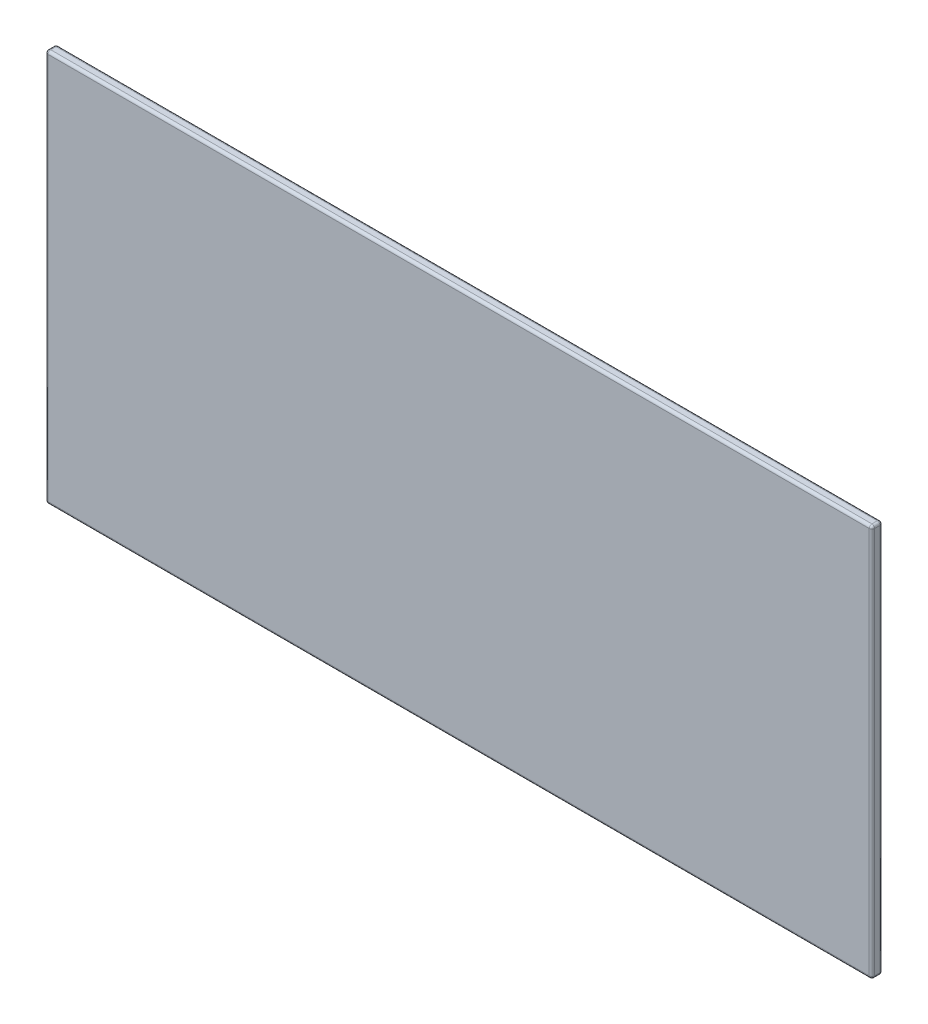
ISO-10303-21;
HEADER;
FILE_DESCRIPTION(('STEP AP214'),'2;1');
FILE_NAME('part.step','',(''),(''),'','','');
FILE_SCHEMA(('AUTOMOTIVE_DESIGN { 1 0 10303 214 1 1 1 1 }'));
ENDSEC;
DATA;
#1=APPLICATION_CONTEXT('core data for automotive mechanical design processes');
#2=APPLICATION_PROTOCOL_DEFINITION('international standard','automotive_design',2000,#1);
#3=PRODUCT_CONTEXT('',#1,'mechanical');
#4=PRODUCT('Part','Part','',(#3));
#5=PRODUCT_RELATED_PRODUCT_CATEGORY('part','',(#4));
#6=PRODUCT_DEFINITION_FORMATION('','',#4);
#7=PRODUCT_DEFINITION_CONTEXT('part definition',#1,'design');
#8=PRODUCT_DEFINITION('design','',#6,#7);
#9=PRODUCT_DEFINITION_SHAPE('','',#8);
#10=(LENGTH_UNIT() NAMED_UNIT(*) SI_UNIT(.MILLI.,.METRE.));
#11=(NAMED_UNIT(*) PLANE_ANGLE_UNIT() SI_UNIT($,.RADIAN.));
#12=(NAMED_UNIT(*) SI_UNIT($,.STERADIAN.) SOLID_ANGLE_UNIT());
#13=UNCERTAINTY_MEASURE_WITH_UNIT(LENGTH_MEASURE(1.E-05),#10,'distance_accuracy_value','');
#14=(GEOMETRIC_REPRESENTATION_CONTEXT(3) GLOBAL_UNCERTAINTY_ASSIGNED_CONTEXT((#13)) GLOBAL_UNIT_ASSIGNED_CONTEXT((#10,
#11,#12)) REPRESENTATION_CONTEXT('',''));
#15=CARTESIAN_POINT('',(0.,0.,0.));
#16=DIRECTION('',(0.,0.,1.));
#17=DIRECTION('',(1.,0.,0.));
#18=AXIS2_PLACEMENT_3D('',#15,#16,#17);
#19=CARTESIAN_POINT('',(77.35,-36.75,2.));
#20=DIRECTION('',(-1.,0.,0.));
#21=DIRECTION('',(0.,0.,1.));
#22=AXIS2_PLACEMENT_3D('',#19,#20,#21);
#23=PLANE('',#22);
#24=DIRECTION('',(0.,1.,0.));
#25=VECTOR('',#24,1.);
#26=CARTESIAN_POINT('',(77.35,-36.75,1.5));
#27=LINE('',#26,#25);
#28=CARTESIAN_POINT('',(77.35,36.25,1.5));
#29=VERTEX_POINT('',#28);
#30=CARTESIAN_POINT('',(77.35,-36.25,1.5));
#31=VERTEX_POINT('',#30);
#32=EDGE_CURVE('E42',#29,#31,#27,.F.);
#33=ORIENTED_EDGE('',*,*,#32,.T.);
#34=DIRECTION('',(0.,0.,-1.));
#35=VECTOR('',#34,1.);
#36=CARTESIAN_POINT('',(77.35,-36.25,2.));
#37=LINE('',#36,#35);
#38=CARTESIAN_POINT('',(77.35,-36.25,0.5));
#39=VERTEX_POINT('',#38);
#40=EDGE_CURVE('E11',#31,#39,#37,.T.);
#41=ORIENTED_EDGE('',*,*,#40,.T.);
#42=DIRECTION('',(0.,1.,0.));
#43=VECTOR('',#42,1.);
#44=CARTESIAN_POINT('',(77.35,36.75,0.5));
#45=LINE('',#44,#43);
#46=CARTESIAN_POINT('',(77.35,36.25,0.5));
#47=VERTEX_POINT('',#46);
#48=EDGE_CURVE('E194',#39,#47,#45,.T.);
#49=ORIENTED_EDGE('',*,*,#48,.T.);
#50=DIRECTION('',(0.,0.,-1.));
#51=VECTOR('',#50,1.);
#52=CARTESIAN_POINT('',(77.35,36.25,2.));
#53=LINE('',#52,#51);
#54=EDGE_CURVE('E53',#47,#29,#53,.F.);
#55=ORIENTED_EDGE('',*,*,#54,.T.);
#56=EDGE_LOOP('',(#33,#41,#49,#55));
#57=FACE_BOUND('',#56,.T.);
#58=ADVANCED_FACE('F33',(#57),#23,.F.);
#59=CARTESIAN_POINT('',(-77.35,36.75,2.));
#60=DIRECTION('',(0.,-1.,0.));
#61=DIRECTION('',(0.,0.,-1.));
#62=AXIS2_PLACEMENT_3D('',#59,#60,#61);
#63=PLANE('',#62);
#64=DIRECTION('',(0.,0.,-1.));
#65=VECTOR('',#64,1.);
#66=CARTESIAN_POINT('',(-76.85,36.75,2.));
#67=LINE('',#66,#65);
#68=CARTESIAN_POINT('',(-76.85,36.75,0.5));
#69=VERTEX_POINT('',#68);
#70=CARTESIAN_POINT('',(-76.85,36.75,1.5));
#71=VERTEX_POINT('',#70);
#72=EDGE_CURVE('E189',#69,#71,#67,.F.);
#73=ORIENTED_EDGE('',*,*,#72,.T.);
#74=DIRECTION('',(-1.,0.,0.));
#75=VECTOR('',#74,1.);
#76=CARTESIAN_POINT('',(-77.35,36.75,1.5));
#77=LINE('',#76,#75);
#78=CARTESIAN_POINT('',(76.85,36.75,1.5));
#79=VERTEX_POINT('',#78);
#80=EDGE_CURVE('E191',#71,#79,#77,.F.);
#81=ORIENTED_EDGE('',*,*,#80,.T.);
#82=DIRECTION('',(0.,0.,-1.));
#83=VECTOR('',#82,1.);
#84=CARTESIAN_POINT('',(76.85,36.75,2.));
#85=LINE('',#84,#83);
#86=CARTESIAN_POINT('',(76.85,36.75,0.5));
#87=VERTEX_POINT('',#86);
#88=EDGE_CURVE('E185',#79,#87,#85,.T.);
#89=ORIENTED_EDGE('',*,*,#88,.T.);
#90=DIRECTION('',(-1.,0.,0.));
#91=VECTOR('',#90,1.);
#92=CARTESIAN_POINT('',(-77.35,36.75,0.5));
#93=LINE('',#92,#91);
#94=EDGE_CURVE('E187',#87,#69,#93,.T.);
#95=ORIENTED_EDGE('',*,*,#94,.T.);
#96=EDGE_LOOP('',(#73,#81,#89,#95));
#97=FACE_BOUND('',#96,.T.);
#98=ADVANCED_FACE('F278',(#97),#63,.F.);
#99=CARTESIAN_POINT('',(-77.35,-36.75,2.));
#100=DIRECTION('',(1.,0.,0.));
#101=DIRECTION('',(0.,0.,-1.));
#102=AXIS2_PLACEMENT_3D('',#99,#100,#101);
#103=PLANE('',#102);
#104=DIRECTION('',(0.,0.,-1.));
#105=VECTOR('',#104,1.);
#106=CARTESIAN_POINT('',(-77.35,-36.25,2.));
#107=LINE('',#106,#105);
#108=CARTESIAN_POINT('',(-77.35,-36.25,0.5));
#109=VERTEX_POINT('',#108);
#110=CARTESIAN_POINT('',(-77.35,-36.25,1.5));
#111=VERTEX_POINT('',#110);
#112=EDGE_CURVE('E180',#109,#111,#107,.F.);
#113=ORIENTED_EDGE('',*,*,#112,.T.);
#114=DIRECTION('',(0.,-1.,0.));
#115=VECTOR('',#114,1.);
#116=CARTESIAN_POINT('',(-77.35,-36.75,1.5));
#117=LINE('',#116,#115);
#118=CARTESIAN_POINT('',(-77.35,36.25,1.5));
#119=VERTEX_POINT('',#118);
#120=EDGE_CURVE('E182',#111,#119,#117,.F.);
#121=ORIENTED_EDGE('',*,*,#120,.T.);
#122=DIRECTION('',(0.,0.,-1.));
#123=VECTOR('',#122,1.);
#124=CARTESIAN_POINT('',(-77.35,36.25,2.));
#125=LINE('',#124,#123);
#126=CARTESIAN_POINT('',(-77.35,36.25,0.5));
#127=VERTEX_POINT('',#126);
#128=EDGE_CURVE('E176',#119,#127,#125,.T.);
#129=ORIENTED_EDGE('',*,*,#128,.T.);
#130=DIRECTION('',(0.,-1.,0.));
#131=VECTOR('',#130,1.);
#132=CARTESIAN_POINT('',(-77.35,-36.75,0.5));
#133=LINE('',#132,#131);
#134=EDGE_CURVE('E178',#127,#109,#133,.T.);
#135=ORIENTED_EDGE('',*,*,#134,.T.);
#136=EDGE_LOOP('',(#113,#121,#129,#135));
#137=FACE_BOUND('',#136,.T.);
#138=ADVANCED_FACE('F269',(#137),#103,.F.);
#139=CARTESIAN_POINT('',(-77.35,-36.75,2.));
#140=DIRECTION('',(0.,1.,0.));
#141=DIRECTION('',(0.,0.,1.));
#142=AXIS2_PLACEMENT_3D('',#139,#140,#141);
#143=PLANE('',#142);
#144=DIRECTION('',(1.,0.,0.));
#145=VECTOR('',#144,1.);
#146=CARTESIAN_POINT('',(-77.35,-36.75,1.5));
#147=LINE('',#146,#145);
#148=CARTESIAN_POINT('',(76.85,-36.75,1.5));
#149=VERTEX_POINT('',#148);
#150=CARTESIAN_POINT('',(-76.85,-36.75,1.5));
#151=VERTEX_POINT('',#150);
#152=EDGE_CURVE('E129',#149,#151,#147,.F.);
#153=ORIENTED_EDGE('',*,*,#152,.T.);
#154=DIRECTION('',(0.,0.,-1.));
#155=VECTOR('',#154,1.);
#156=CARTESIAN_POINT('',(-76.85,-36.75,2.));
#157=LINE('',#156,#155);
#158=CARTESIAN_POINT('',(-76.85,-36.75,0.5));
#159=VERTEX_POINT('',#158);
#160=EDGE_CURVE('E165',#151,#159,#157,.T.);
#161=ORIENTED_EDGE('',*,*,#160,.T.);
#162=DIRECTION('',(1.,0.,0.));
#163=VECTOR('',#162,1.);
#164=CARTESIAN_POINT('',(77.35,-36.75,0.5));
#165=LINE('',#164,#163);
#166=CARTESIAN_POINT('',(76.85,-36.75,0.5));
#167=VERTEX_POINT('',#166);
#168=EDGE_CURVE('E158',#159,#167,#165,.T.);
#169=ORIENTED_EDGE('',*,*,#168,.T.);
#170=DIRECTION('',(0.,0.,-1.));
#171=VECTOR('',#170,1.);
#172=CARTESIAN_POINT('',(76.85,-36.75,2.));
#173=LINE('',#172,#171);
#174=EDGE_CURVE('E156',#167,#149,#173,.F.);
#175=ORIENTED_EDGE('',*,*,#174,.T.);
#176=EDGE_LOOP('',(#153,#161,#169,#175));
#177=FACE_BOUND('',#176,.T.);
#178=ADVANCED_FACE('F356',(#177),#143,.F.);
#179=CARTESIAN_POINT('',(0.,0.,2.));
#180=DIRECTION('',(0.,0.,-1.));
#181=DIRECTION('',(-1.,0.,0.));
#182=AXIS2_PLACEMENT_3D('',#179,#180,#181);
#183=PLANE('',#182);
#184=DIRECTION('',(0.,-1.,0.));
#185=VECTOR('',#184,1.);
#186=CARTESIAN_POINT('',(-76.85,0.,2.));
#187=LINE('',#186,#185);
#188=CARTESIAN_POINT('',(-76.85,36.25,2.));
#189=VERTEX_POINT('',#188);
#190=CARTESIAN_POINT('',(-76.85,-36.25,2.));
#191=VERTEX_POINT('',#190);
#192=EDGE_CURVE('E154',#189,#191,#187,.T.);
#193=ORIENTED_EDGE('',*,*,#192,.T.);
#194=DIRECTION('',(1.,0.,0.));
#195=VECTOR('',#194,1.);
#196=CARTESIAN_POINT('',(0.,-36.25,2.));
#197=LINE('',#196,#195);
#198=CARTESIAN_POINT('',(76.85,-36.25,2.));
#199=VERTEX_POINT('',#198);
#200=EDGE_CURVE('E127',#191,#199,#197,.T.);
#201=ORIENTED_EDGE('',*,*,#200,.T.);
#202=DIRECTION('',(0.,1.,0.));
#203=VECTOR('',#202,1.);
#204=CARTESIAN_POINT('',(76.85,0.,2.));
#205=LINE('',#204,#203);
#206=CARTESIAN_POINT('',(76.85,36.25,2.));
#207=VERTEX_POINT('',#206);
#208=EDGE_CURVE('E144',#199,#207,#205,.T.);
#209=ORIENTED_EDGE('',*,*,#208,.T.);
#210=DIRECTION('',(-1.,0.,0.));
#211=VECTOR('',#210,1.);
#212=CARTESIAN_POINT('',(0.,36.25,2.));
#213=LINE('',#212,#211);
#214=EDGE_CURVE('E150',#207,#189,#213,.T.);
#215=ORIENTED_EDGE('',*,*,#214,.T.);
#216=EDGE_LOOP('',(#193,#201,#209,#215));
#217=FACE_BOUND('',#216,.T.);
#218=ADVANCED_FACE('F152',(#217),#183,.F.);
#219=CARTESIAN_POINT('',(0.,0.,0.));
#220=DIRECTION('',(0.,0.,-1.));
#221=DIRECTION('',(-1.,0.,0.));
#222=AXIS2_PLACEMENT_3D('',#219,#220,#221);
#223=PLANE('',#222);
#224=DIRECTION('',(0.,1.,0.));
#225=VECTOR('',#224,1.);
#226=CARTESIAN_POINT('',(76.85,-36.75,0.));
#227=LINE('',#226,#225);
#228=CARTESIAN_POINT('',(76.85,36.25,0.));
#229=VERTEX_POINT('',#228);
#230=CARTESIAN_POINT('',(76.85,-36.25,0.));
#231=VERTEX_POINT('',#230);
#232=EDGE_CURVE('E167',#229,#231,#227,.F.);
#233=ORIENTED_EDGE('',*,*,#232,.T.);
#234=DIRECTION('',(1.,0.,0.));
#235=VECTOR('',#234,1.);
#236=CARTESIAN_POINT('',(-77.35,-36.25,0.));
#237=LINE('',#236,#235);
#238=CARTESIAN_POINT('',(-76.85,-36.25,0.));
#239=VERTEX_POINT('',#238);
#240=EDGE_CURVE('E173',#231,#239,#237,.F.);
#241=ORIENTED_EDGE('',*,*,#240,.T.);
#242=DIRECTION('',(0.,-1.,0.));
#243=VECTOR('',#242,1.);
#244=CARTESIAN_POINT('',(-76.85,36.75,0.));
#245=LINE('',#244,#243);
#246=CARTESIAN_POINT('',(-76.85,36.25,0.));
#247=VERTEX_POINT('',#246);
#248=EDGE_CURVE('E171',#239,#247,#245,.F.);
#249=ORIENTED_EDGE('',*,*,#248,.T.);
#250=DIRECTION('',(-1.,0.,0.));
#251=VECTOR('',#250,1.);
#252=CARTESIAN_POINT('',(77.35,36.25,0.));
#253=LINE('',#252,#251);
#254=EDGE_CURVE('E169',#247,#229,#253,.F.);
#255=ORIENTED_EDGE('',*,*,#254,.T.);
#256=EDGE_LOOP('',(#233,#241,#249,#255));
#257=FACE_BOUND('',#256,.T.);
#258=ADVANCED_FACE('F296',(#257),#223,.T.);
#259=CARTESIAN_POINT('',(-77.35,36.25,0.5));
#260=DIRECTION('',(1.,0.,0.));
#261=DIRECTION('',(0.,0.,-1.));
#262=AXIS2_PLACEMENT_3D('',#259,#260,#261);
#263=CYLINDRICAL_SURFACE('',#262,0.5);
#264=CARTESIAN_POINT('',(-76.85,36.25,0.5));
#265=DIRECTION('',(-1.,0.,0.));
#266=DIRECTION('',(0.,0.,1.));
#267=AXIS2_PLACEMENT_3D('',#264,#265,#266);
#268=CIRCLE('',#267,0.5);
#269=EDGE_CURVE('E37',#69,#247,#268,.T.);
#270=ORIENTED_EDGE('',*,*,#269,.F.);
#271=ORIENTED_EDGE('',*,*,#94,.F.);
#272=CARTESIAN_POINT('',(76.85,36.25,0.5));
#273=DIRECTION('',(1.,0.,0.));
#274=DIRECTION('',(0.,0.,-1.));
#275=AXIS2_PLACEMENT_3D('',#272,#273,#274);
#276=CIRCLE('',#275,0.5);
#277=EDGE_CURVE('E246',#229,#87,#276,.T.);
#278=ORIENTED_EDGE('',*,*,#277,.F.);
#279=ORIENTED_EDGE('',*,*,#254,.F.);
#280=EDGE_LOOP('',(#270,#271,#278,#279));
#281=FACE_BOUND('',#280,.T.);
#282=ADVANCED_FACE('F35',(#281),#263,.T.);
#283=CARTESIAN_POINT('',(-76.85,36.25,0.5));
#284=DIRECTION('',(0.,0.,1.));
#285=DIRECTION('',(1.,0.,0.));
#286=AXIS2_PLACEMENT_3D('',#283,#284,#285);
#287=SPHERICAL_SURFACE('',#286,0.5);
#288=CARTESIAN_POINT('',(-76.85,36.25,0.5));
#289=DIRECTION('',(0.,0.,-1.));
#290=DIRECTION('',(-1.,0.,0.));
#291=AXIS2_PLACEMENT_3D('',#288,#289,#290);
#292=CIRCLE('',#291,0.5);
#293=EDGE_CURVE('E241',#69,#127,#292,.F.);
#294=ORIENTED_EDGE('',*,*,#293,.F.);
#295=ORIENTED_EDGE('',*,*,#269,.T.);
#296=CARTESIAN_POINT('',(-76.85,36.25,0.5));
#297=DIRECTION('',(0.,1.,0.));
#298=DIRECTION('',(0.,0.,1.));
#299=AXIS2_PLACEMENT_3D('',#296,#297,#298);
#300=CIRCLE('',#299,0.5);
#301=EDGE_CURVE('E244',#127,#247,#300,.F.);
#302=ORIENTED_EDGE('',*,*,#301,.F.);
#303=EDGE_LOOP('',(#294,#295,#302));
#304=FACE_BOUND('',#303,.T.);
#305=ADVANCED_FACE('F257',(#304),#287,.T.);
#306=CARTESIAN_POINT('',(76.85,36.25,0.5));
#307=DIRECTION('',(0.,0.,1.));
#308=DIRECTION('',(1.,0.,0.));
#309=AXIS2_PLACEMENT_3D('',#306,#307,#308);
#310=SPHERICAL_SURFACE('',#309,0.5);
#311=CARTESIAN_POINT('',(76.85,36.25,0.5));
#312=DIRECTION('',(0.,1.,0.));
#313=DIRECTION('',(0.,0.,1.));
#314=AXIS2_PLACEMENT_3D('',#311,#312,#313);
#315=CIRCLE('',#314,0.5);
#316=EDGE_CURVE('E235',#229,#47,#315,.F.);
#317=ORIENTED_EDGE('',*,*,#316,.F.);
#318=ORIENTED_EDGE('',*,*,#277,.T.);
#319=CARTESIAN_POINT('',(76.85,36.25,0.5));
#320=DIRECTION('',(0.,0.,-1.));
#321=DIRECTION('',(-1.,0.,0.));
#322=AXIS2_PLACEMENT_3D('',#319,#320,#321);
#323=CIRCLE('',#322,0.5);
#324=EDGE_CURVE('E238',#47,#87,#323,.F.);
#325=ORIENTED_EDGE('',*,*,#324,.F.);
#326=EDGE_LOOP('',(#317,#318,#325));
#327=FACE_BOUND('',#326,.T.);
#328=ADVANCED_FACE('F289',(#327),#310,.T.);
#329=CARTESIAN_POINT('',(-76.85,-36.75,0.5));
#330=DIRECTION('',(0.,1.,0.));
#331=DIRECTION('',(0.,0.,1.));
#332=AXIS2_PLACEMENT_3D('',#329,#330,#331);
#333=CYLINDRICAL_SURFACE('',#332,0.5);
#334=ORIENTED_EDGE('',*,*,#301,.T.);
#335=ORIENTED_EDGE('',*,*,#248,.F.);
#336=CARTESIAN_POINT('',(-76.85,-36.25,0.5));
#337=DIRECTION('',(0.,-1.,0.));
#338=DIRECTION('',(0.,0.,-1.));
#339=AXIS2_PLACEMENT_3D('',#336,#337,#338);
#340=CIRCLE('',#339,0.5);
#341=EDGE_CURVE('E230',#109,#239,#340,.T.);
#342=ORIENTED_EDGE('',*,*,#341,.F.);
#343=ORIENTED_EDGE('',*,*,#134,.F.);
#344=EDGE_LOOP('',(#334,#335,#342,#343));
#345=FACE_BOUND('',#344,.T.);
#346=ADVANCED_FACE('F265',(#345),#333,.T.);
#347=CARTESIAN_POINT('',(-76.85,36.25,2.));
#348=DIRECTION('',(0.,0.,-1.));
#349=DIRECTION('',(-1.,0.,0.));
#350=AXIS2_PLACEMENT_3D('',#347,#348,#349);
#351=CYLINDRICAL_SURFACE('',#350,0.5);
#352=ORIENTED_EDGE('',*,*,#293,.T.);
#353=ORIENTED_EDGE('',*,*,#128,.F.);
#354=CARTESIAN_POINT('',(-76.85,36.25,1.5));
#355=DIRECTION('',(0.,0.,1.));
#356=DIRECTION('',(1.,0.,0.));
#357=AXIS2_PLACEMENT_3D('',#354,#355,#356);
#358=CIRCLE('',#357,0.5);
#359=EDGE_CURVE('E227',#71,#119,#358,.T.);
#360=ORIENTED_EDGE('',*,*,#359,.F.);
#361=ORIENTED_EDGE('',*,*,#72,.F.);
#362=EDGE_LOOP('',(#352,#353,#360,#361));
#363=FACE_BOUND('',#362,.T.);
#364=ADVANCED_FACE('F275',(#363),#351,.T.);
#365=CARTESIAN_POINT('',(0.,36.25,1.5));
#366=DIRECTION('',(-1.,0.,0.));
#367=DIRECTION('',(0.,0.,1.));
#368=AXIS2_PLACEMENT_3D('',#365,#366,#367);
#369=CYLINDRICAL_SURFACE('',#368,0.5);
#370=CARTESIAN_POINT('',(76.85,36.25,1.5));
#371=DIRECTION('',(1.,0.,0.));
#372=DIRECTION('',(0.,0.,-1.));
#373=AXIS2_PLACEMENT_3D('',#370,#371,#372);
#374=CIRCLE('',#373,0.5);
#375=EDGE_CURVE('E221',#79,#207,#374,.T.);
#376=ORIENTED_EDGE('',*,*,#375,.F.);
#377=ORIENTED_EDGE('',*,*,#80,.F.);
#378=CARTESIAN_POINT('',(-76.85,36.25,1.5));
#379=DIRECTION('',(-1.,0.,0.));
#380=DIRECTION('',(0.,0.,1.));
#381=AXIS2_PLACEMENT_3D('',#378,#379,#380);
#382=CIRCLE('',#381,0.5);
#383=EDGE_CURVE('E224',#189,#71,#382,.T.);
#384=ORIENTED_EDGE('',*,*,#383,.F.);
#385=ORIENTED_EDGE('',*,*,#214,.F.);
#386=EDGE_LOOP('',(#376,#377,#384,#385));
#387=FACE_BOUND('',#386,.T.);
#388=ADVANCED_FACE('F282',(#387),#369,.T.);
#389=CARTESIAN_POINT('',(76.85,36.25,2.));
#390=DIRECTION('',(0.,0.,-1.));
#391=DIRECTION('',(-1.,0.,0.));
#392=AXIS2_PLACEMENT_3D('',#389,#390,#391);
#393=CYLINDRICAL_SURFACE('',#392,0.5);
#394=ORIENTED_EDGE('',*,*,#324,.T.);
#395=ORIENTED_EDGE('',*,*,#88,.F.);
#396=CARTESIAN_POINT('',(76.85,36.25,1.5));
#397=DIRECTION('',(0.,0.,1.));
#398=DIRECTION('',(1.,0.,0.));
#399=AXIS2_PLACEMENT_3D('',#396,#397,#398);
#400=CIRCLE('',#399,0.5);
#401=EDGE_CURVE('E219',#29,#79,#400,.T.);
#402=ORIENTED_EDGE('',*,*,#401,.F.);
#403=ORIENTED_EDGE('',*,*,#54,.F.);
#404=EDGE_LOOP('',(#394,#395,#402,#403));
#405=FACE_BOUND('',#404,.T.);
#406=ADVANCED_FACE('F287',(#405),#393,.T.);
#407=CARTESIAN_POINT('',(76.85,-36.75,0.5));
#408=DIRECTION('',(0.,-1.,0.));
#409=DIRECTION('',(0.,0.,-1.));
#410=AXIS2_PLACEMENT_3D('',#407,#408,#409);
#411=CYLINDRICAL_SURFACE('',#410,0.5);
#412=ORIENTED_EDGE('',*,*,#316,.T.);
#413=ORIENTED_EDGE('',*,*,#48,.F.);
#414=CARTESIAN_POINT('',(76.85,-36.25,0.5));
#415=DIRECTION('',(0.,-1.,0.));
#416=DIRECTION('',(0.,0.,-1.));
#417=AXIS2_PLACEMENT_3D('',#414,#415,#416);
#418=CIRCLE('',#417,0.5);
#419=EDGE_CURVE('E216',#231,#39,#418,.T.);
#420=ORIENTED_EDGE('',*,*,#419,.F.);
#421=ORIENTED_EDGE('',*,*,#232,.F.);
#422=EDGE_LOOP('',(#412,#413,#420,#421));
#423=FACE_BOUND('',#422,.T.);
#424=ADVANCED_FACE('F293',(#423),#411,.T.);
#425=CARTESIAN_POINT('',(-77.35,-36.25,0.5));
#426=DIRECTION('',(-1.,0.,0.));
#427=DIRECTION('',(0.,0.,1.));
#428=AXIS2_PLACEMENT_3D('',#425,#426,#427);
#429=CYLINDRICAL_SURFACE('',#428,0.5);
#430=CARTESIAN_POINT('',(-76.85,-36.25,0.5));
#431=DIRECTION('',(-1.,0.,0.));
#432=DIRECTION('',(0.,0.,1.));
#433=AXIS2_PLACEMENT_3D('',#430,#431,#432);
#434=CIRCLE('',#433,0.5);
#435=EDGE_CURVE('E232',#239,#159,#434,.T.);
#436=ORIENTED_EDGE('',*,*,#435,.F.);
#437=ORIENTED_EDGE('',*,*,#240,.F.);
#438=CARTESIAN_POINT('',(76.85,-36.25,0.5));
#439=DIRECTION('',(1.,0.,0.));
#440=DIRECTION('',(0.,0.,-1.));
#441=AXIS2_PLACEMENT_3D('',#438,#439,#440);
#442=CIRCLE('',#441,0.5);
#443=EDGE_CURVE('E213',#167,#231,#442,.T.);
#444=ORIENTED_EDGE('',*,*,#443,.F.);
#445=ORIENTED_EDGE('',*,*,#168,.F.);
#446=EDGE_LOOP('',(#436,#437,#444,#445));
#447=FACE_BOUND('',#446,.T.);
#448=ADVANCED_FACE('F300',(#447),#429,.T.);
#449=CARTESIAN_POINT('',(-76.85,-36.25,0.5));
#450=DIRECTION('',(0.,0.,1.));
#451=DIRECTION('',(1.,0.,0.));
#452=AXIS2_PLACEMENT_3D('',#449,#450,#451);
#453=SPHERICAL_SURFACE('',#452,0.5);
#454=ORIENTED_EDGE('',*,*,#341,.T.);
#455=ORIENTED_EDGE('',*,*,#435,.T.);
#456=CARTESIAN_POINT('',(-76.85,-36.25,0.5));
#457=DIRECTION('',(0.,0.,-1.));
#458=DIRECTION('',(-1.,0.,0.));
#459=AXIS2_PLACEMENT_3D('',#456,#457,#458);
#460=CIRCLE('',#459,0.5);
#461=EDGE_CURVE('E210',#109,#159,#460,.F.);
#462=ORIENTED_EDGE('',*,*,#461,.F.);
#463=EDGE_LOOP('',(#454,#455,#462));
#464=FACE_BOUND('',#463,.T.);
#465=ADVANCED_FACE('F304',(#464),#453,.T.);
#466=CARTESIAN_POINT('',(-76.85,36.25,1.5));
#467=DIRECTION('',(0.,0.,1.));
#468=DIRECTION('',(1.,0.,0.));
#469=AXIS2_PLACEMENT_3D('',#466,#467,#468);
#470=SPHERICAL_SURFACE('',#469,0.5);
#471=ORIENTED_EDGE('',*,*,#383,.T.);
#472=ORIENTED_EDGE('',*,*,#359,.T.);
#473=CARTESIAN_POINT('',(-76.85,36.25,1.5));
#474=DIRECTION('',(0.,1.,0.));
#475=DIRECTION('',(0.,0.,1.));
#476=AXIS2_PLACEMENT_3D('',#473,#474,#475);
#477=CIRCLE('',#476,0.5);
#478=EDGE_CURVE('E208',#189,#119,#477,.F.);
#479=ORIENTED_EDGE('',*,*,#478,.F.);
#480=EDGE_LOOP('',(#471,#472,#479));
#481=FACE_BOUND('',#480,.T.);
#482=ADVANCED_FACE('F315',(#481),#470,.T.);
#483=CARTESIAN_POINT('',(76.85,36.25,1.5));
#484=DIRECTION('',(0.,0.,1.));
#485=DIRECTION('',(1.,0.,0.));
#486=AXIS2_PLACEMENT_3D('',#483,#484,#485);
#487=SPHERICAL_SURFACE('',#486,0.5);
#488=ORIENTED_EDGE('',*,*,#401,.T.);
#489=ORIENTED_EDGE('',*,*,#375,.T.);
#490=CARTESIAN_POINT('',(76.85,36.25,1.5));
#491=DIRECTION('',(0.,1.,0.));
#492=DIRECTION('',(0.,0.,1.));
#493=AXIS2_PLACEMENT_3D('',#490,#491,#492);
#494=CIRCLE('',#493,0.5);
#495=EDGE_CURVE('E147',#29,#207,#494,.F.);
#496=ORIENTED_EDGE('',*,*,#495,.F.);
#497=EDGE_LOOP('',(#488,#489,#496));
#498=FACE_BOUND('',#497,.T.);
#499=ADVANCED_FACE('F317',(#498),#487,.T.);
#500=CARTESIAN_POINT('',(76.85,-36.25,0.5));
#501=DIRECTION('',(0.,0.,1.));
#502=DIRECTION('',(1.,0.,0.));
#503=AXIS2_PLACEMENT_3D('',#500,#501,#502);
#504=SPHERICAL_SURFACE('',#503,0.5);
#505=ORIENTED_EDGE('',*,*,#443,.T.);
#506=ORIENTED_EDGE('',*,*,#419,.T.);
#507=CARTESIAN_POINT('',(76.85,-36.25,0.5));
#508=DIRECTION('',(0.,0.,-1.));
#509=DIRECTION('',(-1.,0.,0.));
#510=AXIS2_PLACEMENT_3D('',#507,#508,#509);
#511=CIRCLE('',#510,0.5);
#512=EDGE_CURVE('E205',#167,#39,#511,.F.);
#513=ORIENTED_EDGE('',*,*,#512,.F.);
#514=EDGE_LOOP('',(#505,#506,#513));
#515=FACE_BOUND('',#514,.T.);
#516=ADVANCED_FACE('F323',(#515),#504,.T.);
#517=CARTESIAN_POINT('',(-76.85,-36.25,2.));
#518=DIRECTION('',(0.,0.,-1.));
#519=DIRECTION('',(-1.,0.,0.));
#520=AXIS2_PLACEMENT_3D('',#517,#518,#519);
#521=CYLINDRICAL_SURFACE('',#520,0.5);
#522=ORIENTED_EDGE('',*,*,#461,.T.);
#523=ORIENTED_EDGE('',*,*,#160,.F.);
#524=CARTESIAN_POINT('',(-76.85,-36.25,1.5));
#525=DIRECTION('',(0.,0.,1.));
#526=DIRECTION('',(1.,0.,0.));
#527=AXIS2_PLACEMENT_3D('',#524,#525,#526);
#528=CIRCLE('',#527,0.5);
#529=EDGE_CURVE('E202',#111,#151,#528,.T.);
#530=ORIENTED_EDGE('',*,*,#529,.F.);
#531=ORIENTED_EDGE('',*,*,#112,.F.);
#532=EDGE_LOOP('',(#522,#523,#530,#531));
#533=FACE_BOUND('',#532,.T.);
#534=ADVANCED_FACE('F307',(#533),#521,.T.);
#535=CARTESIAN_POINT('',(-76.85,0.,1.5));
#536=DIRECTION('',(0.,-1.,0.));
#537=DIRECTION('',(0.,0.,-1.));
#538=AXIS2_PLACEMENT_3D('',#535,#536,#537);
#539=CYLINDRICAL_SURFACE('',#538,0.5);
#540=ORIENTED_EDGE('',*,*,#478,.T.);
#541=ORIENTED_EDGE('',*,*,#120,.F.);
#542=CARTESIAN_POINT('',(-76.85,-36.25,1.5));
#543=DIRECTION('',(0.,-1.,0.));
#544=DIRECTION('',(0.,0.,-1.));
#545=AXIS2_PLACEMENT_3D('',#542,#543,#544);
#546=CIRCLE('',#545,0.5);
#547=EDGE_CURVE('E141',#191,#111,#546,.T.);
#548=ORIENTED_EDGE('',*,*,#547,.F.);
#549=ORIENTED_EDGE('',*,*,#192,.F.);
#550=EDGE_LOOP('',(#540,#541,#548,#549));
#551=FACE_BOUND('',#550,.T.);
#552=ADVANCED_FACE('F313',(#551),#539,.T.);
#553=CARTESIAN_POINT('',(76.85,0.,1.5));
#554=DIRECTION('',(0.,1.,0.));
#555=DIRECTION('',(0.,0.,1.));
#556=AXIS2_PLACEMENT_3D('',#553,#554,#555);
#557=CYLINDRICAL_SURFACE('',#556,0.5);
#558=ORIENTED_EDGE('',*,*,#495,.T.);
#559=ORIENTED_EDGE('',*,*,#208,.F.);
#560=CARTESIAN_POINT('',(76.85,-36.25,1.5));
#561=DIRECTION('',(0.,-1.,0.));
#562=DIRECTION('',(0.,0.,-1.));
#563=AXIS2_PLACEMENT_3D('',#560,#561,#562);
#564=CIRCLE('',#563,0.5);
#565=EDGE_CURVE('E135',#31,#199,#564,.T.);
#566=ORIENTED_EDGE('',*,*,#565,.F.);
#567=ORIENTED_EDGE('',*,*,#32,.F.);
#568=EDGE_LOOP('',(#558,#559,#566,#567));
#569=FACE_BOUND('',#568,.T.);
#570=ADVANCED_FACE('F145',(#569),#557,.T.);
#571=CARTESIAN_POINT('',(76.85,-36.25,2.));
#572=DIRECTION('',(0.,0.,-1.));
#573=DIRECTION('',(-1.,0.,0.));
#574=AXIS2_PLACEMENT_3D('',#571,#572,#573);
#575=CYLINDRICAL_SURFACE('',#574,0.5);
#576=ORIENTED_EDGE('',*,*,#512,.T.);
#577=ORIENTED_EDGE('',*,*,#40,.F.);
#578=CARTESIAN_POINT('',(76.85,-36.25,1.5));
#579=DIRECTION('',(0.,0.,1.));
#580=DIRECTION('',(1.,0.,0.));
#581=AXIS2_PLACEMENT_3D('',#578,#579,#580);
#582=CIRCLE('',#581,0.5);
#583=EDGE_CURVE('E139',#149,#31,#582,.T.);
#584=ORIENTED_EDGE('',*,*,#583,.F.);
#585=ORIENTED_EDGE('',*,*,#174,.F.);
#586=EDGE_LOOP('',(#576,#577,#584,#585));
#587=FACE_BOUND('',#586,.T.);
#588=ADVANCED_FACE('F340',(#587),#575,.T.);
#589=CARTESIAN_POINT('',(-76.85,-36.25,1.5));
#590=DIRECTION('',(0.,0.,1.));
#591=DIRECTION('',(1.,0.,0.));
#592=AXIS2_PLACEMENT_3D('',#589,#590,#591);
#593=SPHERICAL_SURFACE('',#592,0.5);
#594=ORIENTED_EDGE('',*,*,#547,.T.);
#595=ORIENTED_EDGE('',*,*,#529,.T.);
#596=CARTESIAN_POINT('',(-76.85,-36.25,1.5));
#597=DIRECTION('',(-1.,0.,0.));
#598=DIRECTION('',(0.,0.,1.));
#599=AXIS2_PLACEMENT_3D('',#596,#597,#598);
#600=CIRCLE('',#599,0.5);
#601=EDGE_CURVE('E132',#191,#151,#600,.F.);
#602=ORIENTED_EDGE('',*,*,#601,.F.);
#603=EDGE_LOOP('',(#594,#595,#602));
#604=FACE_BOUND('',#603,.T.);
#605=ADVANCED_FACE('F311',(#604),#593,.T.);
#606=CARTESIAN_POINT('',(76.85,-36.25,1.5));
#607=DIRECTION('',(0.,0.,1.));
#608=DIRECTION('',(1.,0.,0.));
#609=AXIS2_PLACEMENT_3D('',#606,#607,#608);
#610=SPHERICAL_SURFACE('',#609,0.5);
#611=ORIENTED_EDGE('',*,*,#583,.T.);
#612=ORIENTED_EDGE('',*,*,#565,.T.);
#613=CARTESIAN_POINT('',(76.85,-36.25,1.5));
#614=DIRECTION('',(1.,0.,0.));
#615=DIRECTION('',(0.,0.,-1.));
#616=AXIS2_PLACEMENT_3D('',#613,#614,#615);
#617=CIRCLE('',#616,0.5);
#618=EDGE_CURVE('E123',#149,#199,#617,.F.);
#619=ORIENTED_EDGE('',*,*,#618,.F.);
#620=EDGE_LOOP('',(#611,#612,#619));
#621=FACE_BOUND('',#620,.T.);
#622=ADVANCED_FACE('F137',(#621),#610,.T.);
#623=CARTESIAN_POINT('',(0.,-36.25,1.5));
#624=DIRECTION('',(1.,0.,0.));
#625=DIRECTION('',(0.,0.,-1.));
#626=AXIS2_PLACEMENT_3D('',#623,#624,#625);
#627=CYLINDRICAL_SURFACE('',#626,0.5);
#628=ORIENTED_EDGE('',*,*,#601,.T.);
#629=ORIENTED_EDGE('',*,*,#152,.F.);
#630=ORIENTED_EDGE('',*,*,#618,.T.);
#631=ORIENTED_EDGE('',*,*,#200,.F.);
#632=EDGE_LOOP('',(#628,#629,#630,#631));
#633=FACE_BOUND('',#632,.T.);
#634=ADVANCED_FACE('F125',(#633),#627,.T.);
#635=CLOSED_SHELL('',(#58,#98,#138,#178,#218,#258,#282,#305,#328,#346,#364,#388,#406,#424,#448,
#465,#482,#499,#516,#534,#552,#570,#588,#605,#622,#634));
#636=MANIFOLD_SOLID_BREP('B2',#635);
#637=ADVANCED_BREP_SHAPE_REPRESENTATION('',(#18,#636),#14);
#638=SHAPE_DEFINITION_REPRESENTATION(#9,#637);
ENDSEC;
END-ISO-10303-21;
